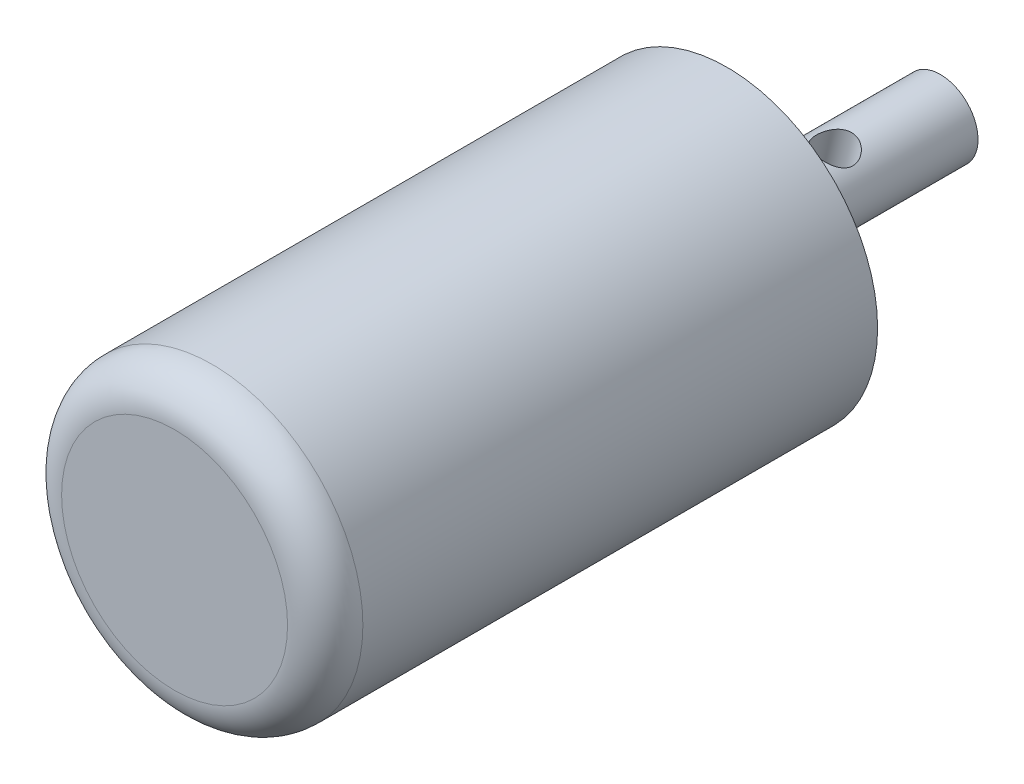
ISO-10303-21;
HEADER;
FILE_DESCRIPTION(('STEP AP214'),'2;1');
FILE_NAME('part.step','',(''),(''),'','','');
FILE_SCHEMA(('AUTOMOTIVE_DESIGN { 1 0 10303 214 1 1 1 1 }'));
ENDSEC;
DATA;
#1=APPLICATION_CONTEXT('core data for automotive mechanical design processes');
#2=APPLICATION_PROTOCOL_DEFINITION('international standard','automotive_design',2000,#1);
#3=PRODUCT_CONTEXT('',#1,'mechanical');
#4=PRODUCT('Part','Part','',(#3));
#5=PRODUCT_RELATED_PRODUCT_CATEGORY('part','',(#4));
#6=PRODUCT_DEFINITION_FORMATION('','',#4);
#7=PRODUCT_DEFINITION_CONTEXT('part definition',#1,'design');
#8=PRODUCT_DEFINITION('design','',#6,#7);
#9=PRODUCT_DEFINITION_SHAPE('','',#8);
#10=(LENGTH_UNIT() NAMED_UNIT(*) SI_UNIT(.MILLI.,.METRE.));
#11=(NAMED_UNIT(*) PLANE_ANGLE_UNIT() SI_UNIT($,.RADIAN.));
#12=(NAMED_UNIT(*) SI_UNIT($,.STERADIAN.) SOLID_ANGLE_UNIT());
#13=UNCERTAINTY_MEASURE_WITH_UNIT(LENGTH_MEASURE(1.E-05),#10,'distance_accuracy_value','');
#14=(GEOMETRIC_REPRESENTATION_CONTEXT(3) GLOBAL_UNCERTAINTY_ASSIGNED_CONTEXT((#13)) GLOBAL_UNIT_ASSIGNED_CONTEXT((#10,
#11,#12)) REPRESENTATION_CONTEXT('',''));
#15=CARTESIAN_POINT('',(0.,0.,0.));
#16=DIRECTION('',(0.,0.,1.));
#17=DIRECTION('',(1.,0.,0.));
#18=AXIS2_PLACEMENT_3D('',#15,#16,#17);
#19=CARTESIAN_POINT('',(0.,0.,44.));
#20=DIRECTION('',(0.,0.,-1.));
#21=DIRECTION('',(-1.,0.,0.));
#22=AXIS2_PLACEMENT_3D('',#19,#20,#21);
#23=CYLINDRICAL_SURFACE('',#22,12.);
#24=CARTESIAN_POINT('',(0.,0.,41.));
#25=DIRECTION('',(0.,0.,1.));
#26=DIRECTION('',(1.,0.,0.));
#27=AXIS2_PLACEMENT_3D('',#24,#25,#26);
#28=CIRCLE('',#27,12.);
#29=CARTESIAN_POINT('',(12.,0.,41.));
#30=VERTEX_POINT('',#29);
#31=EDGE_CURVE('E11',#30,#30,#28,.F.);
#32=ORIENTED_EDGE('',*,*,#31,.T.);
#33=EDGE_LOOP('',(#32));
#34=FACE_BOUND('',#33,.T.);
#35=CARTESIAN_POINT('',(0.,0.,0.));
#36=DIRECTION('',(0.,0.,1.));
#37=DIRECTION('',(1.,0.,0.));
#38=AXIS2_PLACEMENT_3D('',#35,#36,#37);
#39=CIRCLE('',#38,12.);
#40=CARTESIAN_POINT('',(12.,0.,0.));
#41=VERTEX_POINT('',#40);
#42=EDGE_CURVE('E82',#41,#41,#39,.T.);
#43=ORIENTED_EDGE('',*,*,#42,.T.);
#44=EDGE_LOOP('',(#43));
#45=FACE_BOUND('',#44,.T.);
#46=ADVANCED_FACE('F36',(#34,#45),#23,.T.);
#47=CARTESIAN_POINT('',(0.,0.,44.));
#48=DIRECTION('',(0.,0.,1.));
#49=DIRECTION('',(1.,0.,0.));
#50=AXIS2_PLACEMENT_3D('',#47,#48,#49);
#51=PLANE('',#50);
#52=CARTESIAN_POINT('',(0.,0.,44.));
#53=DIRECTION('',(0.,0.,1.));
#54=DIRECTION('',(1.,0.,0.));
#55=AXIS2_PLACEMENT_3D('',#52,#53,#54);
#56=CIRCLE('',#55,9.);
#57=CARTESIAN_POINT('',(9.,0.,44.));
#58=VERTEX_POINT('',#57);
#59=EDGE_CURVE('E44',#58,#58,#56,.T.);
#60=ORIENTED_EDGE('',*,*,#59,.T.);
#61=EDGE_LOOP('',(#60));
#62=FACE_BOUND('',#61,.T.);
#63=ADVANCED_FACE('F100',(#62),#51,.T.);
#64=CARTESIAN_POINT('',(0.,0.,0.));
#65=DIRECTION('',(0.,0.,1.));
#66=DIRECTION('',(1.,0.,0.));
#67=AXIS2_PLACEMENT_3D('',#64,#65,#66);
#68=PLANE('',#67);
#69=CARTESIAN_POINT('',(0.,-9.,0.));
#70=DIRECTION('',(0.,0.,-1.));
#71=DIRECTION('',(-1.,0.,0.));
#72=AXIS2_PLACEMENT_3D('',#69,#70,#71);
#73=CIRCLE('',#72,1.5);
#74=CARTESIAN_POINT('',(-1.5,-9.,0.));
#75=VERTEX_POINT('',#74);
#76=EDGE_CURVE('E85',#75,#75,#73,.T.);
#77=ORIENTED_EDGE('',*,*,#76,.F.);
#78=EDGE_LOOP('',(#77));
#79=FACE_BOUND('',#78,.T.);
#80=CARTESIAN_POINT('',(7.79422863405993,4.50000000000004,0.));
#81=DIRECTION('',(0.,0.,-1.));
#82=DIRECTION('',(-1.,0.,0.));
#83=AXIS2_PLACEMENT_3D('',#80,#81,#82);
#84=CIRCLE('',#83,1.5);
#85=CARTESIAN_POINT('',(6.29422863405993,4.50000000000004,0.));
#86=VERTEX_POINT('',#85);
#87=EDGE_CURVE('E185',#86,#86,#84,.T.);
#88=ORIENTED_EDGE('',*,*,#87,.F.);
#89=EDGE_LOOP('',(#88));
#90=FACE_BOUND('',#89,.T.);
#91=CARTESIAN_POINT('',(-7.79422863405999,4.49999999999993,0.));
#92=DIRECTION('',(0.,0.,-1.));
#93=DIRECTION('',(-1.,0.,0.));
#94=AXIS2_PLACEMENT_3D('',#91,#92,#93);
#95=CIRCLE('',#94,1.5);
#96=CARTESIAN_POINT('',(-9.29422863405999,4.49999999999993,0.));
#97=VERTEX_POINT('',#96);
#98=EDGE_CURVE('E75',#97,#97,#95,.T.);
#99=ORIENTED_EDGE('',*,*,#98,.F.);
#100=EDGE_LOOP('',(#99));
#101=FACE_BOUND('',#100,.T.);
#102=CARTESIAN_POINT('',(0.,0.,0.));
#103=DIRECTION('',(0.,0.,-1.));
#104=DIRECTION('',(-1.,0.,0.));
#105=AXIS2_PLACEMENT_3D('',#102,#103,#104);
#106=CIRCLE('',#105,6.5);
#107=CARTESIAN_POINT('',(-6.5,0.,0.));
#108=VERTEX_POINT('',#107);
#109=EDGE_CURVE('E92',#108,#108,#106,.T.);
#110=ORIENTED_EDGE('',*,*,#109,.F.);
#111=EDGE_LOOP('',(#110));
#112=FACE_BOUND('',#111,.T.);
#113=ORIENTED_EDGE('',*,*,#42,.F.);
#114=EDGE_LOOP('',(#113));
#115=FACE_BOUND('',#114,.T.);
#116=ADVANCED_FACE('F117',(#79,#90,#101,#112,#115),#68,.F.);
#117=CARTESIAN_POINT('',(0.,0.,-2.));
#118=DIRECTION('',(0.,0.,1.));
#119=DIRECTION('',(1.,0.,0.));
#120=AXIS2_PLACEMENT_3D('',#117,#118,#119);
#121=CYLINDRICAL_SURFACE('',#120,6.5);
#122=CARTESIAN_POINT('',(0.,0.,-2.));
#123=DIRECTION('',(0.,0.,-1.));
#124=DIRECTION('',(-1.,0.,0.));
#125=AXIS2_PLACEMENT_3D('',#122,#123,#124);
#126=CIRCLE('',#125,6.5);
#127=CARTESIAN_POINT('',(-6.5,0.,-2.));
#128=VERTEX_POINT('',#127);
#129=EDGE_CURVE('E78',#128,#128,#126,.T.);
#130=ORIENTED_EDGE('',*,*,#129,.F.);
#131=EDGE_LOOP('',(#130));
#132=FACE_BOUND('',#131,.T.);
#133=ORIENTED_EDGE('',*,*,#109,.T.);
#134=EDGE_LOOP('',(#133));
#135=FACE_BOUND('',#134,.T.);
#136=ADVANCED_FACE('F122',(#132,#135),#121,.T.);
#137=CARTESIAN_POINT('',(0.,0.,-2.));
#138=DIRECTION('',(0.,0.,-1.));
#139=DIRECTION('',(-1.,0.,0.));
#140=AXIS2_PLACEMENT_3D('',#137,#138,#139);
#141=PLANE('',#140);
#142=CARTESIAN_POINT('',(0.,0.,-2.));
#143=DIRECTION('',(0.,0.,-1.));
#144=DIRECTION('',(-1.,0.,0.));
#145=AXIS2_PLACEMENT_3D('',#142,#143,#144);
#146=CIRCLE('',#145,3.);
#147=CARTESIAN_POINT('',(-3.,0.,-2.));
#148=VERTEX_POINT('',#147);
#149=EDGE_CURVE('E90',#148,#148,#146,.T.);
#150=ORIENTED_EDGE('',*,*,#149,.F.);
#151=EDGE_LOOP('',(#150));
#152=FACE_BOUND('',#151,.T.);
#153=ORIENTED_EDGE('',*,*,#129,.T.);
#154=EDGE_LOOP('',(#153));
#155=FACE_BOUND('',#154,.T.);
#156=ADVANCED_FACE('F127',(#152,#155),#141,.T.);
#157=CARTESIAN_POINT('',(0.,0.,-17.));
#158=DIRECTION('',(0.,0.,1.));
#159=DIRECTION('',(1.,0.,0.));
#160=AXIS2_PLACEMENT_3D('',#157,#158,#159);
#161=CYLINDRICAL_SURFACE('',#160,3.);
#162=CARTESIAN_POINT('',(2.02770884310267,2.2109719237483,-8.));
#163=CARTESIAN_POINT('',(2.0277049942123,2.21097975430355,-7.92183828770713));
#164=CARTESIAN_POINT('',(2.02248165658206,2.21580118207423,-7.84357788271244));
#165=CARTESIAN_POINT('',(2.0017818419669,2.23451377776502,-7.68945910298427));
#166=CARTESIAN_POINT('',(1.98628381973984,2.24842400332428,-7.61360612743489));
#167=CARTESIAN_POINT('',(1.94566841870983,2.28365627975373,-7.46682250348409));
#168=CARTESIAN_POINT('',(1.92060216383348,2.30493888436941,-7.39586802128962));
#169=CARTESIAN_POINT('',(1.86144643200097,2.35296927673644,-7.25986369700492));
#170=CARTESIAN_POINT('',(1.82735646689637,2.37971736013158,-7.19481417460632));
#171=CARTESIAN_POINT('',(1.74749834178278,2.43904056141811,-7.06654140716374));
#172=CARTESIAN_POINT('',(1.70099888897328,2.47191432433902,-7.00391129648968));
#173=CARTESIAN_POINT('',(1.59858739393172,2.53934603243695,-6.88788741738994));
#174=CARTESIAN_POINT('',(1.54267068389136,2.57390480675058,-6.83449825612472));
#175=CARTESIAN_POINT('',(1.4180026808756,2.64475728313303,-6.73494927327851));
#176=CARTESIAN_POINT('',(1.34864031470109,2.68101090586041,-6.68951934821071));
#177=CARTESIAN_POINT('',(1.20121461321699,2.7502173041652,-6.61228872013136));
#178=CARTESIAN_POINT('',(1.12315680838275,2.78317215278921,-6.58047941579425));
#179=CARTESIAN_POINT('',(0.966204313781258,2.84129298702702,-6.53374300804836));
#180=CARTESIAN_POINT('',(0.887764374879694,2.86684633585144,-6.5177757104667));
#181=CARTESIAN_POINT('',(0.72756557076221,2.91162311418942,-6.49975082198744));
#182=CARTESIAN_POINT('',(0.645808743867957,2.93085036701438,-6.49768481480644));
#183=CARTESIAN_POINT('',(0.488961994053369,2.9608680050795,-6.50712001095553));
#184=CARTESIAN_POINT('',(0.413910571184538,2.97224666674464,-6.51745702328184));
#185=CARTESIAN_POINT('',(0.265558393566175,2.9891560143844,-6.54932126585699));
#186=CARTESIAN_POINT('',(0.19225777024764,2.9946862626639,-6.57084933346434));
#187=CARTESIAN_POINT('',(0.048353634331563,3.00048740347866,-6.62462384913472));
#188=CARTESIAN_POINT('',(-0.0221985314188955,3.00068447194812,-6.6570144697581));
#189=CARTESIAN_POINT('',(-0.157895748419354,2.99661209029502,-6.73139512430224));
#190=CARTESIAN_POINT('',(-0.223038852434093,2.99234103913166,-6.77338859495353));
#191=CARTESIAN_POINT('',(-0.35242196801517,2.9800018101985,-6.87034302729952));
#192=CARTESIAN_POINT('',(-0.415994531070082,2.97161286361561,-6.92615454248902));
#193=CARTESIAN_POINT('',(-0.533531402955411,2.95277744413852,-7.04688458739527));
#194=CARTESIAN_POINT('',(-0.587488316633899,2.942329400538,-7.11181005841109));
#195=CARTESIAN_POINT('',(-0.687247819008993,2.92069524089116,-7.25397228863613));
#196=CARTESIAN_POINT('',(-0.732314982475157,2.9095043886375,-7.33172903458132));
#197=CARTESIAN_POINT('',(-0.807592660474461,2.88952004814144,-7.4944065070385));
#198=CARTESIAN_POINT('',(-0.837818676685494,2.88072406274242,-7.57931964952635));
#199=CARTESIAN_POINT('',(-0.879725705888984,2.86819265163256,-7.74682176692419));
#200=CARTESIAN_POINT('',(-0.89268651378179,2.86411143635531,-7.82906167856533));
#201=CARTESIAN_POINT('',(-0.903408224901951,2.8607504552805,-7.99460201227482));
#202=CARTESIAN_POINT('',(-0.901179865081597,2.86146729781482,-8.07790164367968));
#203=CARTESIAN_POINT('',(-0.882801994806154,2.86718119900109,-8.23348087786809));
#204=CARTESIAN_POINT('',(-0.868201998346837,2.87170146251928,-8.30596917666189));
#205=CARTESIAN_POINT('',(-0.827933185016572,2.88356790056738,-8.44755167940644));
#206=CARTESIAN_POINT('',(-0.802260783570043,2.89091499016955,-8.51664477611991));
#207=CARTESIAN_POINT('',(-0.739544217827355,2.90760541945062,-8.65311699635405));
#208=CARTESIAN_POINT('',(-0.702028437719466,2.91702545564787,-8.72026852528033));
#209=CARTESIAN_POINT('',(-0.617418511363332,2.93609847501787,-8.84820390730849));
#210=CARTESIAN_POINT('',(-0.570319445204659,2.94575157558972,-8.90898446526993));
#211=CARTESIAN_POINT('',(-0.461281824415417,2.96490326117274,-9.03046815128533));
#212=CARTESIAN_POINT('',(-0.398221076142144,2.97422898259916,-9.09019572607649));
#213=CARTESIAN_POINT('',(-0.263147243828853,2.98920894766511,-9.19911835699039));
#214=CARTESIAN_POINT('',(-0.191131148728025,2.99486195242692,-9.24830985534581));
#215=CARTESIAN_POINT('',(-0.0379800735316215,3.00076241655489,-9.33586058892515));
#216=CARTESIAN_POINT('',(0.043345409467177,3.00086327608031,-9.37389967731637));
#217=CARTESIAN_POINT('',(0.210941157595258,2.99374583411446,-9.43570685578609));
#218=CARTESIAN_POINT('',(0.297207007562729,2.98653397452175,-9.45948747704946));
#219=CARTESIAN_POINT('',(0.463542747857822,2.96504761691791,-9.49005284626199));
#220=CARTESIAN_POINT('',(0.543454899485733,2.95148184909028,-9.49819681381417));
#221=CARTESIAN_POINT('',(0.702133646518442,2.91780338680604,-9.5012648981816));
#222=CARTESIAN_POINT('',(0.780900633230267,2.8976929863477,-9.49619364278535));
#223=CARTESIAN_POINT('',(0.929678939282089,2.85330203345262,-9.47387538980657));
#224=CARTESIAN_POINT('',(0.99992519603162,2.82938359196619,-9.4574527261135));
#225=CARTESIAN_POINT('',(1.13555200902032,2.77773127291291,-9.41400950104554));
#226=CARTESIAN_POINT('',(1.2009318658844,2.74999684855696,-9.38698741985982));
#227=CARTESIAN_POINT('',(1.32827016690446,2.69088047006489,-9.32190942175104));
#228=CARTESIAN_POINT('',(1.38996267628392,2.6593932444364,-9.28343101518824));
#229=CARTESIAN_POINT('',(1.50584692135489,2.59553651550209,-9.19706310371143));
#230=CARTESIAN_POINT('',(1.56003519242104,2.56316661287401,-9.14916927632649));
#231=CARTESIAN_POINT('',(1.66530898927257,2.49619991123591,-9.03980429146595));
#232=CARTESIAN_POINT('',(1.71554903392169,2.46170209132289,-8.97745626878421));
#233=CARTESIAN_POINT('',(1.80563279309722,2.3964126205926,-8.84382391830535));
#234=CARTESIAN_POINT('',(1.84546731264949,2.36562426054114,-8.77253176869848));
#235=CARTESIAN_POINT('',(1.91507679899415,2.30966292096282,-8.62004503012857));
#236=CARTESIAN_POINT('',(1.94449408284091,2.28469814586614,-8.5386087033069));
#237=CARTESIAN_POINT('',(1.99046951701782,2.24476774915543,-8.37000139349034));
#238=CARTESIAN_POINT('',(2.00707067958041,2.22976870534299,-8.28285066663097));
#239=CARTESIAN_POINT('',(2.02051495166222,2.21755138847652,-8.16229196652201));
#240=CARTESIAN_POINT('',(2.02320925874522,2.21509142676699,-8.12994815840318));
#241=CARTESIAN_POINT('',(2.02680706569656,2.2118000096266,-8.06507527897664));
#242=CARTESIAN_POINT('',(2.02771044576379,2.21096866313931,-8.03254619542119));
#243=CARTESIAN_POINT('',(2.02770884310267,2.2109719237483,-8.));
#244=B_SPLINE_CURVE_WITH_KNOTS('',3,(#162,#163,#164,#165,#166,#167,#168,#169,#170,#171,#172,
#173,#174,#175,#176,#177,#178,#179,#180,#181,#182,#183,#184,#185,#186,#187,#188,#189,#190,#191,
#192,#193,#194,#195,#196,#197,#198,#199,#200,#201,#202,#203,#204,#205,#206,#207,#208,#209,#210,
#211,#212,#213,#214,#215,#216,#217,#218,#219,#220,#221,#222,#223,#224,#225,#226,#227,#228,#229,
#230,#231,#232,#233,#234,#235,#236,#237,#238,#239,#240,#241,#242,#243),.UNSPECIFIED.,.T.,.F.,(4,
2,2,2,2,2,2,2,2,2,2,2,2,2,2,2,2,2,2,2,2,2,2,2,2,2,2,2,2,2,2,2,2,2,2,2,2,2,2,2,4),(0.,
0.234348183892073,0.469189339237207,0.702792893878329,0.936409088167726,1.18929346874735,
1.44230356626557,1.71236838358145,1.98226240445837,2.23295227451903,2.4834903552906,
2.71224146226807,2.94100968776183,3.1729430209672,3.40495949025408,3.65890787185336,
3.91305072368878,4.18333262594172,4.45333161317557,4.70193436281318,4.9503613978256,
5.17161275136038,5.39293578654094,5.62450944609131,5.85620229330071,6.1171011537092,
6.37808797467303,6.64596272119449,6.91360169713157,7.1566840558423,7.39968130190957,
7.62666637307239,7.85368400268019,8.09041126079208,8.32724745151078,8.58765362775101,
8.84828914267731,9.11716123557907,9.3851269950414,9.48270202777964,9.58028358741811),.UNSPECIFIED.);
#245=CARTESIAN_POINT('',(2.02770884310267,2.2109719237483,-8.));
#246=VERTEX_POINT('',#245);
#247=EDGE_CURVE('E68',#246,#246,#244,.T.);
#248=ORIENTED_EDGE('',*,*,#247,.T.);
#249=EDGE_LOOP('',(#248));
#250=FACE_BOUND('',#249,.T.);
#251=CARTESIAN_POINT('',(0.,0.,-17.));
#252=DIRECTION('',(0.,0.,-1.));
#253=DIRECTION('',(-1.,0.,0.));
#254=AXIS2_PLACEMENT_3D('',#251,#252,#253);
#255=CIRCLE('',#254,3.);
#256=CARTESIAN_POINT('',(-2.16098585163976,-2.08089888005467,-17.));
#257=VERTEX_POINT('',#256);
#258=CARTESIAN_POINT('',(1.07671683875457,-2.80012157756451,-17.));
#259=VERTEX_POINT('',#258);
#260=EDGE_CURVE('E74',#257,#259,#255,.T.);
#261=ORIENTED_EDGE('',*,*,#260,.F.);
#262=DIRECTION('',(0.,0.,-1.));
#263=VECTOR('',#262,1.);
#264=CARTESIAN_POINT('',(-2.16098585163976,-2.08089888005467,-5.5));
#265=LINE('',#264,#263);
#266=CARTESIAN_POINT('',(-2.16098585163976,-2.08089888005467,-5.5));
#267=VERTEX_POINT('',#266);
#268=EDGE_CURVE('E51',#267,#257,#265,.T.);
#269=ORIENTED_EDGE('',*,*,#268,.F.);
#270=CARTESIAN_POINT('',(0.,0.,-5.5));
#271=DIRECTION('',(0.,0.,-1.));
#272=DIRECTION('',(-1.,0.,0.));
#273=AXIS2_PLACEMENT_3D('',#270,#271,#272);
#274=CIRCLE('',#273,3.);
#275=CARTESIAN_POINT('',(1.07671683875457,-2.80012157756451,-5.5));
#276=VERTEX_POINT('',#275);
#277=EDGE_CURVE('E67',#276,#267,#274,.T.);
#278=ORIENTED_EDGE('',*,*,#277,.F.);
#279=DIRECTION('',(0.,0.,-1.));
#280=VECTOR('',#279,1.);
#281=CARTESIAN_POINT('',(1.07671683875457,-2.80012157756451,-5.5));
#282=LINE('',#281,#280);
#283=EDGE_CURVE('E57',#276,#259,#282,.T.);
#284=ORIENTED_EDGE('',*,*,#283,.T.);
#285=EDGE_LOOP('',(#261,#269,#278,#284));
#286=FACE_BOUND('',#285,.T.);
#287=ORIENTED_EDGE('',*,*,#149,.T.);
#288=EDGE_LOOP('',(#287));
#289=FACE_BOUND('',#288,.T.);
#290=ADVANCED_FACE('F72',(#250,#286,#289),#161,.T.);
#291=CARTESIAN_POINT('',(0.,0.,-17.));
#292=DIRECTION('',(0.,0.,-1.));
#293=DIRECTION('',(-1.,0.,0.));
#294=AXIS2_PLACEMENT_3D('',#291,#292,#293);
#295=PLANE('',#294);
#296=DIRECTION('',(0.976204091523837,-0.216853802577038,0.));
#297=VECTOR('',#296,1.);
#298=CARTESIAN_POINT('',(-2.16098585163976,-2.08089888005467,-17.));
#299=LINE('',#298,#297);
#300=EDGE_CURVE('E62',#257,#259,#299,.T.);
#301=ORIENTED_EDGE('',*,*,#300,.F.);
#302=ORIENTED_EDGE('',*,*,#260,.T.);
#303=EDGE_LOOP('',(#301,#302));
#304=FACE_BOUND('',#303,.T.);
#305=ADVANCED_FACE('F77',(#304),#295,.T.);
#306=CARTESIAN_POINT('',(-7.79422863405999,4.49999999999993,5.));
#307=DIRECTION('',(0.,0.,-1.));
#308=DIRECTION('',(-1.,0.,0.));
#309=AXIS2_PLACEMENT_3D('',#306,#307,#308);
#310=CYLINDRICAL_SURFACE('',#309,1.5);
#311=CARTESIAN_POINT('',(-7.79422863405999,4.49999999999993,5.));
#312=DIRECTION('',(0.,0.,-1.));
#313=DIRECTION('',(-1.,0.,0.));
#314=AXIS2_PLACEMENT_3D('',#311,#312,#313);
#315=CIRCLE('',#314,1.5);
#316=CARTESIAN_POINT('',(-9.29422863405999,4.49999999999993,5.));
#317=VERTEX_POINT('',#316);
#318=EDGE_CURVE('E181',#317,#317,#315,.T.);
#319=ORIENTED_EDGE('',*,*,#318,.F.);
#320=EDGE_LOOP('',(#319));
#321=FACE_BOUND('',#320,.T.);
#322=ORIENTED_EDGE('',*,*,#98,.T.);
#323=EDGE_LOOP('',(#322));
#324=FACE_BOUND('',#323,.T.);
#325=ADVANCED_FACE('F171',(#321,#324),#310,.F.);
#326=CARTESIAN_POINT('',(-7.79422863405999,4.49999999999993,5.));
#327=DIRECTION('',(0.,0.,-1.));
#328=DIRECTION('',(-1.,0.,0.));
#329=AXIS2_PLACEMENT_3D('',#326,#327,#328);
#330=PLANE('',#329);
#331=ORIENTED_EDGE('',*,*,#318,.T.);
#332=EDGE_LOOP('',(#331));
#333=FACE_BOUND('',#332,.T.);
#334=ADVANCED_FACE('F168',(#333),#330,.T.);
#335=CARTESIAN_POINT('',(7.79422863405993,4.50000000000004,5.));
#336=DIRECTION('',(0.,0.,-1.));
#337=DIRECTION('',(-1.,0.,0.));
#338=AXIS2_PLACEMENT_3D('',#335,#336,#337);
#339=CYLINDRICAL_SURFACE('',#338,1.5);
#340=CARTESIAN_POINT('',(7.79422863405993,4.50000000000004,5.));
#341=DIRECTION('',(0.,0.,-1.));
#342=DIRECTION('',(-1.,0.,0.));
#343=AXIS2_PLACEMENT_3D('',#340,#341,#342);
#344=CIRCLE('',#343,1.5);
#345=CARTESIAN_POINT('',(6.29422863405993,4.50000000000004,5.));
#346=VERTEX_POINT('',#345);
#347=EDGE_CURVE('E187',#346,#346,#344,.T.);
#348=ORIENTED_EDGE('',*,*,#347,.F.);
#349=EDGE_LOOP('',(#348));
#350=FACE_BOUND('',#349,.T.);
#351=ORIENTED_EDGE('',*,*,#87,.T.);
#352=EDGE_LOOP('',(#351));
#353=FACE_BOUND('',#352,.T.);
#354=ADVANCED_FACE('F164',(#350,#353),#339,.F.);
#355=CARTESIAN_POINT('',(7.79422863405993,4.50000000000004,5.));
#356=DIRECTION('',(0.,0.,-1.));
#357=DIRECTION('',(-1.,0.,0.));
#358=AXIS2_PLACEMENT_3D('',#355,#356,#357);
#359=PLANE('',#358);
#360=ORIENTED_EDGE('',*,*,#347,.T.);
#361=EDGE_LOOP('',(#360));
#362=FACE_BOUND('',#361,.T.);
#363=ADVANCED_FACE('F160',(#362),#359,.T.);
#364=CARTESIAN_POINT('',(0.,-9.,5.));
#365=DIRECTION('',(0.,0.,-1.));
#366=DIRECTION('',(-1.,0.,0.));
#367=AXIS2_PLACEMENT_3D('',#364,#365,#366);
#368=CYLINDRICAL_SURFACE('',#367,1.5);
#369=CARTESIAN_POINT('',(0.,-9.,5.));
#370=DIRECTION('',(0.,0.,-1.));
#371=DIRECTION('',(-1.,0.,0.));
#372=AXIS2_PLACEMENT_3D('',#369,#370,#371);
#373=CIRCLE('',#372,1.5);
#374=CARTESIAN_POINT('',(-1.5,-9.,5.));
#375=VERTEX_POINT('',#374);
#376=EDGE_CURVE('E79',#375,#375,#373,.T.);
#377=ORIENTED_EDGE('',*,*,#376,.F.);
#378=EDGE_LOOP('',(#377));
#379=FACE_BOUND('',#378,.T.);
#380=ORIENTED_EDGE('',*,*,#76,.T.);
#381=EDGE_LOOP('',(#380));
#382=FACE_BOUND('',#381,.T.);
#383=ADVANCED_FACE('F156',(#379,#382),#368,.F.);
#384=CARTESIAN_POINT('',(0.,-9.,5.));
#385=DIRECTION('',(0.,0.,-1.));
#386=DIRECTION('',(-1.,0.,0.));
#387=AXIS2_PLACEMENT_3D('',#384,#385,#386);
#388=PLANE('',#387);
#389=ORIENTED_EDGE('',*,*,#376,.T.);
#390=EDGE_LOOP('',(#389));
#391=FACE_BOUND('',#390,.T.);
#392=ADVANCED_FACE('F152',(#391),#388,.T.);
#393=CARTESIAN_POINT('',(-2.16098585163976,-2.08089888005467,-5.5));
#394=DIRECTION('',(0.216853802577038,0.976204091523837,0.));
#395=DIRECTION('',(-0.976204091523837,0.216853802577038,0.));
#396=AXIS2_PLACEMENT_3D('',#393,#394,#395);
#397=PLANE('',#396);
#398=CARTESIAN_POINT('',(-0.542134506442595,-2.44051022880959,-8.));
#399=DIRECTION('',(-0.216853802577038,-0.976204091523837,0.));
#400=DIRECTION('',(0.976204091523837,-0.216853802577038,0.));
#401=AXIS2_PLACEMENT_3D('',#398,#399,#400);
#402=CIRCLE('',#401,1.5);
#403=CARTESIAN_POINT('',(0.92217163084316,-2.76579093267515,-8.));
#404=VERTEX_POINT('',#403);
#405=EDGE_CURVE('E143',#404,#404,#402,.T.);
#406=ORIENTED_EDGE('',*,*,#405,.F.);
#407=EDGE_LOOP('',(#406));
#408=FACE_BOUND('',#407,.T.);
#409=ORIENTED_EDGE('',*,*,#300,.T.);
#410=ORIENTED_EDGE('',*,*,#283,.F.);
#411=DIRECTION('',(0.976204091523837,-0.216853802577038,0.));
#412=VECTOR('',#411,1.);
#413=CARTESIAN_POINT('',(-2.16098585163976,-2.08089888005467,-5.5));
#414=LINE('',#413,#412);
#415=EDGE_CURVE('E194',#267,#276,#414,.T.);
#416=ORIENTED_EDGE('',*,*,#415,.F.);
#417=ORIENTED_EDGE('',*,*,#268,.T.);
#418=EDGE_LOOP('',(#409,#410,#416,#417));
#419=FACE_BOUND('',#418,.T.);
#420=ADVANCED_FACE('F63',(#408,#419),#397,.F.);
#421=CARTESIAN_POINT('',(0.,0.,-5.5));
#422=DIRECTION('',(0.,0.,-1.));
#423=DIRECTION('',(-1.,0.,0.));
#424=AXIS2_PLACEMENT_3D('',#421,#422,#423);
#425=PLANE('',#424);
#426=ORIENTED_EDGE('',*,*,#277,.T.);
#427=ORIENTED_EDGE('',*,*,#415,.T.);
#428=EDGE_LOOP('',(#426,#427));
#429=FACE_BOUND('',#428,.T.);
#430=ADVANCED_FACE('F108',(#429),#425,.T.);
#431=CARTESIAN_POINT('',(3.10462969236393,13.976015971753,-8.));
#432=DIRECTION('',(-0.216853802577038,-0.976204091523836,0.));
#433=DIRECTION('',(0.976204091523837,-0.216853802577038,0.));
#434=AXIS2_PLACEMENT_3D('',#431,#432,#433);
#435=CYLINDRICAL_SURFACE('',#434,1.5);
#436=ORIENTED_EDGE('',*,*,#405,.T.);
#437=EDGE_LOOP('',(#436));
#438=FACE_BOUND('',#437,.T.);
#439=ORIENTED_EDGE('',*,*,#247,.F.);
#440=EDGE_LOOP('',(#439));
#441=FACE_BOUND('',#440,.T.);
#442=ADVANCED_FACE('F103',(#438,#441),#435,.F.);
#443=CARTESIAN_POINT('',(0.,0.,41.));
#444=DIRECTION('',(0.,0.,1.));
#445=DIRECTION('',(1.,0.,0.));
#446=AXIS2_PLACEMENT_3D('',#443,#444,#445);
#447=TOROIDAL_SURFACE('',#446,9.,3.);
#448=ORIENTED_EDGE('',*,*,#31,.F.);
#449=EDGE_LOOP('',(#448));
#450=FACE_BOUND('',#449,.T.);
#451=ORIENTED_EDGE('',*,*,#59,.F.);
#452=EDGE_LOOP('',(#451));
#453=FACE_BOUND('',#452,.T.);
#454=ADVANCED_FACE('F38',(#450,#453),#447,.T.);
#455=CLOSED_SHELL('',(#46,#63,#116,#136,#156,#290,#305,#325,#334,#354,#363,#383,#392,#420,#430,
#442,#454));
#456=MANIFOLD_SOLID_BREP('B2',#455);
#457=ADVANCED_BREP_SHAPE_REPRESENTATION('',(#18,#456),#14);
#458=SHAPE_DEFINITION_REPRESENTATION(#9,#457);
ENDSEC;
END-ISO-10303-21;
